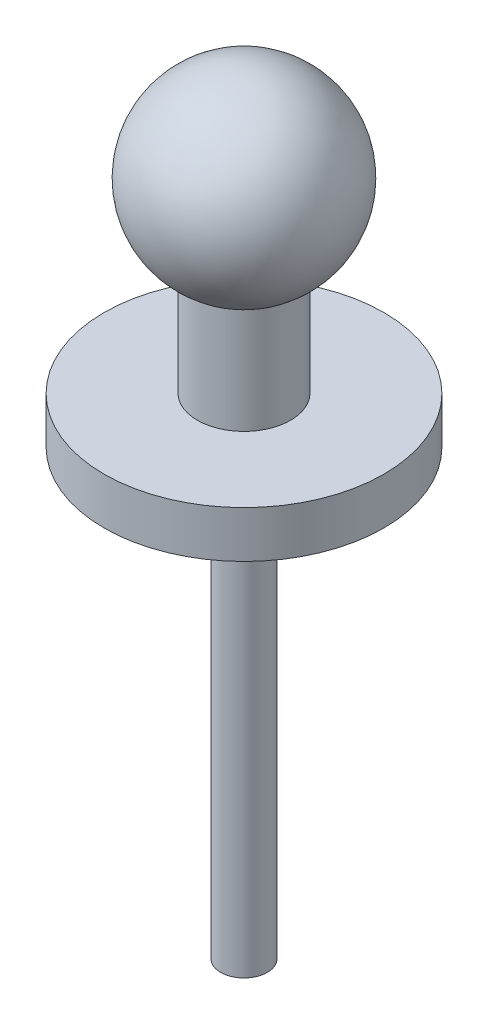
ISO-10303-21;
HEADER;
FILE_DESCRIPTION(('STEP AP214'),'2;1');
FILE_NAME('part.step','',(''),(''),'','','');
FILE_SCHEMA(('AUTOMOTIVE_DESIGN { 1 0 10303 214 1 1 1 1 }'));
ENDSEC;
DATA;
#1=APPLICATION_CONTEXT('core data for automotive mechanical design processes');
#2=APPLICATION_PROTOCOL_DEFINITION('international standard','automotive_design',2000,#1);
#3=PRODUCT_CONTEXT('',#1,'mechanical');
#4=PRODUCT('Part','Part','',(#3));
#5=PRODUCT_RELATED_PRODUCT_CATEGORY('part','',(#4));
#6=PRODUCT_DEFINITION_FORMATION('','',#4);
#7=PRODUCT_DEFINITION_CONTEXT('part definition',#1,'design');
#8=PRODUCT_DEFINITION('design','',#6,#7);
#9=PRODUCT_DEFINITION_SHAPE('','',#8);
#10=(LENGTH_UNIT() NAMED_UNIT(*) SI_UNIT(.MILLI.,.METRE.));
#11=(NAMED_UNIT(*) PLANE_ANGLE_UNIT() SI_UNIT($,.RADIAN.));
#12=(NAMED_UNIT(*) SI_UNIT($,.STERADIAN.) SOLID_ANGLE_UNIT());
#13=UNCERTAINTY_MEASURE_WITH_UNIT(LENGTH_MEASURE(1.E-05),#10,'distance_accuracy_value','');
#14=(GEOMETRIC_REPRESENTATION_CONTEXT(3) GLOBAL_UNCERTAINTY_ASSIGNED_CONTEXT((#13)) GLOBAL_UNIT_ASSIGNED_CONTEXT((#10,
#11,#12)) REPRESENTATION_CONTEXT('',''));
#15=CARTESIAN_POINT('',(0.,0.,0.));
#16=DIRECTION('',(0.,0.,1.));
#17=DIRECTION('',(1.,0.,0.));
#18=AXIS2_PLACEMENT_3D('',#15,#16,#17);
#19=CARTESIAN_POINT('',(0.,50.,0.));
#20=DIRECTION('',(0.,-1.,0.));
#21=DIRECTION('',(0.,0.,-1.));
#22=AXIS2_PLACEMENT_3D('',#19,#20,#21);
#23=CYLINDRICAL_SURFACE('',#22,2.);
#24=CARTESIAN_POINT('',(0.,45.,0.));
#25=DIRECTION('',(0.,1.,0.));
#26=DIRECTION('',(0.,0.,1.));
#27=AXIS2_PLACEMENT_3D('',#24,#25,#26);
#28=CIRCLE('',#27,2.);
#29=CARTESIAN_POINT('',(0.,45.,2.));
#30=VERTEX_POINT('',#29);
#31=EDGE_CURVE('E38',#30,#30,#28,.T.);
#32=ORIENTED_EDGE('',*,*,#31,.T.);
#33=EDGE_LOOP('',(#32));
#34=FACE_BOUND('',#33,.T.);
#35=CARTESIAN_POINT('',(0.,49.5358983848622,0.));
#36=DIRECTION('',(0.,1.,0.));
#37=DIRECTION('',(0.,0.,1.));
#38=AXIS2_PLACEMENT_3D('',#35,#36,#37);
#39=CIRCLE('',#38,2.);
#40=CARTESIAN_POINT('',(0.,49.5358983848622,2.));
#41=VERTEX_POINT('',#40);
#42=EDGE_CURVE('E10',#41,#41,#39,.T.);
#43=ORIENTED_EDGE('',*,*,#42,.F.);
#44=EDGE_LOOP('',(#43));
#45=FACE_BOUND('',#44,.T.);
#46=ADVANCED_FACE('F31',(#34,#45),#23,.T.);
#47=CARTESIAN_POINT('',(0.,43.,0.));
#48=DIRECTION('',(0.,-1.,0.));
#49=DIRECTION('',(0.,0.,-1.));
#50=AXIS2_PLACEMENT_3D('',#47,#48,#49);
#51=CYLINDRICAL_SURFACE('',#50,1.);
#52=CARTESIAN_POINT('',(0.,43.,0.));
#53=DIRECTION('',(0.,1.,0.));
#54=DIRECTION('',(0.,0.,1.));
#55=AXIS2_PLACEMENT_3D('',#52,#53,#54);
#56=CIRCLE('',#55,1.);
#57=CARTESIAN_POINT('',(0.,43.,1.));
#58=VERTEX_POINT('',#57);
#59=EDGE_CURVE('E42',#58,#58,#56,.T.);
#60=ORIENTED_EDGE('',*,*,#59,.F.);
#61=EDGE_LOOP('',(#60));
#62=FACE_BOUND('',#61,.T.);
#63=CARTESIAN_POINT('',(0.,24.,0.));
#64=DIRECTION('',(0.,1.,0.));
#65=DIRECTION('',(0.,0.,1.));
#66=AXIS2_PLACEMENT_3D('',#63,#64,#65);
#67=CIRCLE('',#66,1.);
#68=CARTESIAN_POINT('',(0.,24.,1.));
#69=VERTEX_POINT('',#68);
#70=EDGE_CURVE('E47',#69,#69,#67,.T.);
#71=ORIENTED_EDGE('',*,*,#70,.T.);
#72=EDGE_LOOP('',(#71));
#73=FACE_BOUND('',#72,.T.);
#74=ADVANCED_FACE('F33',(#62,#73),#51,.T.);
#75=CARTESIAN_POINT('',(0.,24.,0.));
#76=DIRECTION('',(0.,1.,0.));
#77=DIRECTION('',(0.,0.,1.));
#78=AXIS2_PLACEMENT_3D('',#75,#76,#77);
#79=PLANE('',#78);
#80=ORIENTED_EDGE('',*,*,#70,.F.);
#81=EDGE_LOOP('',(#80));
#82=FACE_BOUND('',#81,.T.);
#83=ADVANCED_FACE('F59',(#82),#79,.F.);
#84=CARTESIAN_POINT('',(0.,45.,0.));
#85=DIRECTION('',(0.,-1.,0.));
#86=DIRECTION('',(0.,0.,-1.));
#87=AXIS2_PLACEMENT_3D('',#84,#85,#86);
#88=CYLINDRICAL_SURFACE('',#87,6.);
#89=CARTESIAN_POINT('',(0.,45.,0.));
#90=DIRECTION('',(0.,1.,0.));
#91=DIRECTION('',(0.,0.,1.));
#92=AXIS2_PLACEMENT_3D('',#89,#90,#91);
#93=CIRCLE('',#92,6.);
#94=CARTESIAN_POINT('',(0.,45.,6.));
#95=VERTEX_POINT('',#94);
#96=EDGE_CURVE('E50',#95,#95,#93,.T.);
#97=ORIENTED_EDGE('',*,*,#96,.F.);
#98=EDGE_LOOP('',(#97));
#99=FACE_BOUND('',#98,.T.);
#100=CARTESIAN_POINT('',(0.,43.,0.));
#101=DIRECTION('',(0.,1.,0.));
#102=DIRECTION('',(0.,0.,1.));
#103=AXIS2_PLACEMENT_3D('',#100,#101,#102);
#104=CIRCLE('',#103,6.);
#105=CARTESIAN_POINT('',(0.,43.,6.));
#106=VERTEX_POINT('',#105);
#107=EDGE_CURVE('E53',#106,#106,#104,.T.);
#108=ORIENTED_EDGE('',*,*,#107,.T.);
#109=EDGE_LOOP('',(#108));
#110=FACE_BOUND('',#109,.T.);
#111=ADVANCED_FACE('F61',(#99,#110),#88,.T.);
#112=CARTESIAN_POINT('',(0.,45.,0.));
#113=DIRECTION('',(0.,1.,0.));
#114=DIRECTION('',(0.,0.,1.));
#115=AXIS2_PLACEMENT_3D('',#112,#113,#114);
#116=PLANE('',#115);
#117=ORIENTED_EDGE('',*,*,#31,.F.);
#118=EDGE_LOOP('',(#117));
#119=FACE_BOUND('',#118,.T.);
#120=ORIENTED_EDGE('',*,*,#96,.T.);
#121=EDGE_LOOP('',(#120));
#122=FACE_BOUND('',#121,.T.);
#123=ADVANCED_FACE('F66',(#119,#122),#116,.T.);
#124=CARTESIAN_POINT('',(0.,43.,0.));
#125=DIRECTION('',(0.,1.,0.));
#126=DIRECTION('',(0.,0.,1.));
#127=AXIS2_PLACEMENT_3D('',#124,#125,#126);
#128=PLANE('',#127);
#129=ORIENTED_EDGE('',*,*,#59,.T.);
#130=EDGE_LOOP('',(#129));
#131=FACE_BOUND('',#130,.T.);
#132=ORIENTED_EDGE('',*,*,#107,.F.);
#133=EDGE_LOOP('',(#132));
#134=FACE_BOUND('',#133,.T.);
#135=ADVANCED_FACE('F80',(#131,#134),#128,.F.);
#136=CARTESIAN_POINT('',(0.,53.,0.));
#137=DIRECTION('',(-1.,0.,0.));
#138=DIRECTION('',(0.,0.,-1.));
#139=AXIS2_PLACEMENT_3D('',#136,#137,#138);
#140=SPHERICAL_SURFACE('',#139,4.);
#141=CARTESIAN_POINT('',(0.,53.,0.));
#142=DIRECTION('',(0.,1.,0.));
#143=DIRECTION('',(0.,0.,1.));
#144=AXIS2_PLACEMENT_3D('',#141,#142,#143);
#145=SPHERICAL_SURFACE('',#144,4.);
#146=ORIENTED_EDGE('',*,*,#42,.T.);
#147=EDGE_LOOP('',(#146));
#148=FACE_BOUND('',#147,.T.);
#149=ADVANCED_FACE('F77',(#148),#145,.T.);
#150=CLOSED_SHELL('',(#46,#74,#83,#111,#123,#135,#149));
#151=MANIFOLD_SOLID_BREP('B2',#150);
#152=ADVANCED_BREP_SHAPE_REPRESENTATION('',(#18,#151),#14);
#153=SHAPE_DEFINITION_REPRESENTATION(#9,#152);
ENDSEC;
END-ISO-10303-21;
